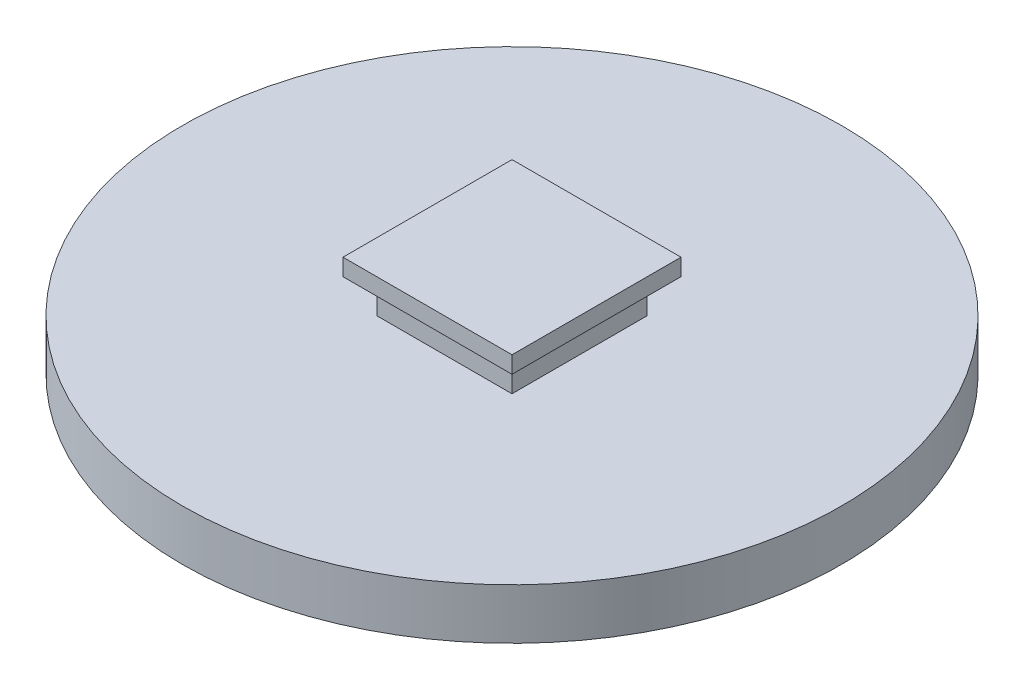
ISO-10303-21;
HEADER;
FILE_DESCRIPTION(('STEP AP214'),'2;1');
FILE_NAME('part.step','',(''),(''),'','','');
FILE_SCHEMA(('AUTOMOTIVE_DESIGN { 1 0 10303 214 1 1 1 1 }'));
ENDSEC;
DATA;
#1=APPLICATION_CONTEXT('core data for automotive mechanical design processes');
#2=APPLICATION_PROTOCOL_DEFINITION('international standard','automotive_design',2000,#1);
#3=PRODUCT_CONTEXT('',#1,'mechanical');
#4=PRODUCT('Part','Part','',(#3));
#5=PRODUCT_RELATED_PRODUCT_CATEGORY('part','',(#4));
#6=PRODUCT_DEFINITION_FORMATION('','',#4);
#7=PRODUCT_DEFINITION_CONTEXT('part definition',#1,'design');
#8=PRODUCT_DEFINITION('design','',#6,#7);
#9=PRODUCT_DEFINITION_SHAPE('','',#8);
#10=(LENGTH_UNIT() NAMED_UNIT(*) SI_UNIT(.MILLI.,.METRE.));
#11=(NAMED_UNIT(*) PLANE_ANGLE_UNIT() SI_UNIT($,.RADIAN.));
#12=(NAMED_UNIT(*) SI_UNIT($,.STERADIAN.) SOLID_ANGLE_UNIT());
#13=UNCERTAINTY_MEASURE_WITH_UNIT(LENGTH_MEASURE(1.E-05),#10,'distance_accuracy_value','');
#14=(GEOMETRIC_REPRESENTATION_CONTEXT(3) GLOBAL_UNCERTAINTY_ASSIGNED_CONTEXT((#13)) GLOBAL_UNIT_ASSIGNED_CONTEXT((#10,
#11,#12)) REPRESENTATION_CONTEXT('',''));
#15=CARTESIAN_POINT('',(0.,0.,0.));
#16=DIRECTION('',(0.,0.,1.));
#17=DIRECTION('',(1.,0.,0.));
#18=AXIS2_PLACEMENT_3D('',#15,#16,#17);
#19=CARTESIAN_POINT('',(0.,0.,0.));
#20=DIRECTION('',(0.,1.,0.));
#21=DIRECTION('',(0.,0.,1.));
#22=AXIS2_PLACEMENT_3D('',#19,#20,#21);
#23=PLANE('',#22);
#24=CARTESIAN_POINT('',(0.,0.,0.));
#25=DIRECTION('',(0.,1.,0.));
#26=DIRECTION('',(0.,0.,1.));
#27=AXIS2_PLACEMENT_3D('',#24,#25,#26);
#28=CIRCLE('',#27,49.53);
#29=CARTESIAN_POINT('',(0.,0.,-49.53));
#30=VERTEX_POINT('',#29);
#31=EDGE_CURVE('E40',#30,#30,#28,.T.);
#32=ORIENTED_EDGE('',*,*,#31,.F.);
#33=EDGE_LOOP('',(#32));
#34=FACE_BOUND('',#33,.T.);
#35=CARTESIAN_POINT('',(-48.26,0.,0.));
#36=DIRECTION('',(0.,-1.,0.));
#37=DIRECTION('',(0.,0.,-1.));
#38=AXIS2_PLACEMENT_3D('',#35,#36,#37);
#39=CIRCLE('',#38,0.889000000000003);
#40=CARTESIAN_POINT('',(-48.26,0.,-0.889000000000015));
#41=VERTEX_POINT('',#40);
#42=EDGE_CURVE('E257',#41,#41,#39,.T.);
#43=ORIENTED_EDGE('',*,*,#42,.F.);
#44=EDGE_LOOP('',(#43));
#45=FACE_BOUND('',#44,.T.);
#46=CARTESIAN_POINT('',(-34.1249732600627,0.,34.1249732600628));
#47=DIRECTION('',(0.,-1.,0.));
#48=DIRECTION('',(-0.707106781186549,0.,-0.707106781186546));
#49=AXIS2_PLACEMENT_3D('',#46,#47,#48);
#50=CIRCLE('',#49,0.889000000000003);
#51=CARTESIAN_POINT('',(-34.7535911885376,0.,33.496355331588));
#52=VERTEX_POINT('',#51);
#53=EDGE_CURVE('E233',#52,#52,#50,.T.);
#54=ORIENTED_EDGE('',*,*,#53,.F.);
#55=EDGE_LOOP('',(#54));
#56=FACE_BOUND('',#55,.T.);
#57=CARTESIAN_POINT('',(-34.1249732600632,0.,-34.1249732600624));
#58=DIRECTION('',(0.,-1.,0.));
#59=DIRECTION('',(0.707106781186539,0.,-0.707106781186556));
#60=AXIS2_PLACEMENT_3D('',#57,#58,#59);
#61=CIRCLE('',#60,0.889000000000003);
#62=CARTESIAN_POINT('',(-33.4963553315884,0.,-34.7535911885372));
#63=VERTEX_POINT('',#62);
#64=EDGE_CURVE('E217',#63,#63,#61,.T.);
#65=ORIENTED_EDGE('',*,*,#64,.F.);
#66=EDGE_LOOP('',(#65));
#67=FACE_BOUND('',#66,.T.);
#68=CARTESIAN_POINT('',(-4.93520847188847E-13,0.,-48.26));
#69=DIRECTION('',(0.,-1.,0.));
#70=DIRECTION('',(1.,0.,0.));
#71=AXIS2_PLACEMENT_3D('',#68,#69,#70);
#72=CIRCLE('',#71,0.889000000000003);
#73=CARTESIAN_POINT('',(0.88899999999951,0.,-48.26));
#74=VERTEX_POINT('',#73);
#75=EDGE_CURVE('E222',#74,#74,#72,.T.);
#76=ORIENTED_EDGE('',*,*,#75,.F.);
#77=EDGE_LOOP('',(#76));
#78=FACE_BOUND('',#77,.T.);
#79=CARTESIAN_POINT('',(34.1249732600625,0.,-34.1249732600631));
#80=DIRECTION('',(0.,-1.,0.));
#81=DIRECTION('',(0.707106781186554,0.,0.707106781186541));
#82=AXIS2_PLACEMENT_3D('',#79,#80,#81);
#83=CIRCLE('',#82,0.889000000000003);
#84=CARTESIAN_POINT('',(34.7535911885373,0.,-33.4963553315882));
#85=VERTEX_POINT('',#84);
#86=EDGE_CURVE('E221',#85,#85,#83,.T.);
#87=ORIENTED_EDGE('',*,*,#86,.F.);
#88=EDGE_LOOP('',(#87));
#89=FACE_BOUND('',#88,.T.);
#90=CARTESIAN_POINT('',(48.26,0.,0.));
#91=DIRECTION('',(0.,-1.,0.));
#92=DIRECTION('',(0.,0.,1.));
#93=AXIS2_PLACEMENT_3D('',#90,#91,#92);
#94=CIRCLE('',#93,0.889000000000003);
#95=CARTESIAN_POINT('',(48.26,0.,0.889000000000015));
#96=VERTEX_POINT('',#95);
#97=EDGE_CURVE('E246',#96,#96,#94,.T.);
#98=ORIENTED_EDGE('',*,*,#97,.F.);
#99=EDGE_LOOP('',(#98));
#100=FACE_BOUND('',#99,.T.);
#101=CARTESIAN_POINT('',(34.124973260063,0.,34.1249732600626));
#102=DIRECTION('',(0.,-1.,0.));
#103=DIRECTION('',(-0.707106781186544,0.,0.707106781186551));
#104=AXIS2_PLACEMENT_3D('',#101,#102,#103);
#105=CIRCLE('',#104,0.889000000000003);
#106=CARTESIAN_POINT('',(33.4963553315881,0.,34.7535911885374));
#107=VERTEX_POINT('',#106);
#108=EDGE_CURVE('E240',#107,#107,#105,.T.);
#109=ORIENTED_EDGE('',*,*,#108,.F.);
#110=EDGE_LOOP('',(#109));
#111=FACE_BOUND('',#110,.T.);
#112=CARTESIAN_POINT('',(1.56523068363708E-13,0.,48.26));
#113=DIRECTION('',(0.,-1.,0.));
#114=DIRECTION('',(-1.,0.,0.));
#115=AXIS2_PLACEMENT_3D('',#112,#113,#114);
#116=CIRCLE('',#115,0.889000000000003);
#117=CARTESIAN_POINT('',(-0.888999999999847,0.,48.26));
#118=VERTEX_POINT('',#117);
#119=EDGE_CURVE('E234',#118,#118,#116,.T.);
#120=ORIENTED_EDGE('',*,*,#119,.F.);
#121=EDGE_LOOP('',(#120));
#122=FACE_BOUND('',#121,.T.);
#123=DIRECTION('',(0.,0.,-1.));
#124=VECTOR('',#123,1.);
#125=CARTESIAN_POINT('',(-2.5273,0.,25.273));
#126=LINE('',#125,#124);
#127=CARTESIAN_POINT('',(-2.5273,0.,25.273));
#128=VERTEX_POINT('',#127);
#129=CARTESIAN_POINT('',(-2.52729999999999,0.,-25.273));
#130=VERTEX_POINT('',#129);
#131=EDGE_CURVE('E184',#128,#130,#126,.T.);
#132=ORIENTED_EDGE('',*,*,#131,.F.);
#133=DIRECTION('',(-1.,0.,0.));
#134=VECTOR('',#133,1.);
#135=CARTESIAN_POINT('',(2.52729999999999,0.,25.273));
#136=LINE('',#135,#134);
#137=CARTESIAN_POINT('',(2.52729999999999,0.,25.273));
#138=VERTEX_POINT('',#137);
#139=EDGE_CURVE('E189',#138,#128,#136,.T.);
#140=ORIENTED_EDGE('',*,*,#139,.F.);
#141=DIRECTION('',(0.,0.,1.));
#142=VECTOR('',#141,1.);
#143=CARTESIAN_POINT('',(2.52729999999999,0.,25.273));
#144=LINE('',#143,#142);
#145=CARTESIAN_POINT('',(2.52730000000001,0.,-25.273));
#146=VERTEX_POINT('',#145);
#147=EDGE_CURVE('E201',#146,#138,#144,.T.);
#148=ORIENTED_EDGE('',*,*,#147,.F.);
#149=DIRECTION('',(1.,0.,0.));
#150=VECTOR('',#149,1.);
#151=CARTESIAN_POINT('',(2.52730000000001,0.,-25.273));
#152=LINE('',#151,#150);
#153=EDGE_CURVE('E198',#130,#146,#152,.T.);
#154=ORIENTED_EDGE('',*,*,#153,.F.);
#155=EDGE_LOOP('',(#132,#140,#148,#154));
#156=FACE_BOUND('',#155,.T.);
#157=ADVANCED_FACE('F36',(#34,#45,#56,#67,#78,#89,#100,#111,#122,#156),#23,.F.);
#158=CARTESIAN_POINT('',(0.,7.62,0.));
#159=DIRECTION('',(0.,-1.,0.));
#160=DIRECTION('',(0.,0.,-1.));
#161=AXIS2_PLACEMENT_3D('',#158,#159,#160);
#162=CYLINDRICAL_SURFACE('',#161,49.53);
#163=CARTESIAN_POINT('',(0.,7.62,0.));
#164=DIRECTION('',(0.,1.,0.));
#165=DIRECTION('',(0.,0.,1.));
#166=AXIS2_PLACEMENT_3D('',#163,#164,#165);
#167=CIRCLE('',#166,49.53);
#168=CARTESIAN_POINT('',(0.,7.62,-49.53));
#169=VERTEX_POINT('',#168);
#170=EDGE_CURVE('E11',#169,#169,#167,.T.);
#171=CARTESIAN_POINT('',(0.,7.62,-49.53));
#172=CARTESIAN_POINT('',(0.,7.540625,-49.53));
#173=CARTESIAN_POINT('',(0.,7.46125,-49.53));
#174=CARTESIAN_POINT('',(0.,7.3025,-49.53));
#175=CARTESIAN_POINT('',(0.,7.223125,-49.53));
#176=CARTESIAN_POINT('',(0.,7.064375,-49.53));
#177=CARTESIAN_POINT('',(0.,6.985,-49.53));
#178=CARTESIAN_POINT('',(0.,6.82625,-49.53));
#179=CARTESIAN_POINT('',(0.,6.746875,-49.53));
#180=CARTESIAN_POINT('',(0.,6.588125,-49.53));
#181=CARTESIAN_POINT('',(0.,6.50875,-49.53));
#182=CARTESIAN_POINT('',(0.,6.35,-49.53));
#183=CARTESIAN_POINT('',(0.,6.270625,-49.53));
#184=CARTESIAN_POINT('',(0.,6.111875,-49.53));
#185=CARTESIAN_POINT('',(0.,6.0325,-49.53));
#186=CARTESIAN_POINT('',(0.,5.87375,-49.53));
#187=CARTESIAN_POINT('',(0.,5.794375,-49.53));
#188=CARTESIAN_POINT('',(0.,5.635625,-49.53));
#189=CARTESIAN_POINT('',(0.,5.55625,-49.53));
#190=CARTESIAN_POINT('',(0.,5.3975,-49.53));
#191=CARTESIAN_POINT('',(0.,5.318125,-49.53));
#192=CARTESIAN_POINT('',(0.,5.159375,-49.53));
#193=CARTESIAN_POINT('',(0.,5.08,-49.53));
#194=CARTESIAN_POINT('',(0.,4.92125,-49.53));
#195=CARTESIAN_POINT('',(0.,4.841875,-49.53));
#196=CARTESIAN_POINT('',(0.,4.683125,-49.53));
#197=CARTESIAN_POINT('',(0.,4.60375,-49.53));
#198=CARTESIAN_POINT('',(0.,4.445,-49.53));
#199=CARTESIAN_POINT('',(0.,4.365625,-49.53));
#200=CARTESIAN_POINT('',(0.,4.206875,-49.53));
#201=CARTESIAN_POINT('',(0.,4.1275,-49.53));
#202=CARTESIAN_POINT('',(0.,3.96875,-49.53));
#203=CARTESIAN_POINT('',(0.,3.889375,-49.53));
#204=CARTESIAN_POINT('',(0.,3.730625,-49.53));
#205=CARTESIAN_POINT('',(0.,3.65125,-49.53));
#206=CARTESIAN_POINT('',(0.,3.4925,-49.53));
#207=CARTESIAN_POINT('',(0.,3.413125,-49.53));
#208=CARTESIAN_POINT('',(0.,3.254375,-49.53));
#209=CARTESIAN_POINT('',(0.,3.175,-49.53));
#210=CARTESIAN_POINT('',(0.,3.01625,-49.53));
#211=CARTESIAN_POINT('',(0.,2.936875,-49.53));
#212=CARTESIAN_POINT('',(0.,2.778125,-49.53));
#213=CARTESIAN_POINT('',(0.,2.69875,-49.53));
#214=CARTESIAN_POINT('',(0.,2.54,-49.53));
#215=CARTESIAN_POINT('',(0.,2.460625,-49.53));
#216=CARTESIAN_POINT('',(0.,2.301875,-49.53));
#217=CARTESIAN_POINT('',(0.,2.2225,-49.53));
#218=CARTESIAN_POINT('',(0.,2.06375,-49.53));
#219=CARTESIAN_POINT('',(0.,1.984375,-49.53));
#220=CARTESIAN_POINT('',(0.,1.825625,-49.53));
#221=CARTESIAN_POINT('',(0.,1.74625,-49.53));
#222=CARTESIAN_POINT('',(0.,1.5875,-49.53));
#223=CARTESIAN_POINT('',(0.,1.508125,-49.53));
#224=CARTESIAN_POINT('',(0.,1.349375,-49.53));
#225=CARTESIAN_POINT('',(0.,1.27,-49.53));
#226=CARTESIAN_POINT('',(0.,1.11125,-49.53));
#227=CARTESIAN_POINT('',(0.,1.031875,-49.53));
#228=CARTESIAN_POINT('',(0.,0.873125,-49.53));
#229=CARTESIAN_POINT('',(0.,0.79375,-49.53));
#230=CARTESIAN_POINT('',(0.,0.635,-49.53));
#231=CARTESIAN_POINT('',(0.,0.555625,-49.53));
#232=CARTESIAN_POINT('',(0.,0.396875,-49.53));
#233=CARTESIAN_POINT('',(0.,0.3175,-49.53));
#234=CARTESIAN_POINT('',(0.,0.15875,-49.53));
#235=CARTESIAN_POINT('',(0.,0.0793749999999999,-49.53));
#236=CARTESIAN_POINT('',(0.,0.,-49.53));
#237=B_SPLINE_CURVE_WITH_KNOTS('',3,(#171,#172,#173,#174,#175,#176,#177,#178,#179,#180,#181,
#182,#183,#184,#185,#186,#187,#188,#189,#190,#191,#192,#193,#194,#195,#196,#197,#198,#199,#200,
#201,#202,#203,#204,#205,#206,#207,#208,#209,#210,#211,#212,#213,#214,#215,#216,#217,#218,#219,
#220,#221,#222,#223,#224,#225,#226,#227,#228,#229,#230,#231,#232,#233,#234,#235,#236),
.UNSPECIFIED.,.F.,.F.,(4,2,2,2,2,2,2,2,2,2,2,2,2,2,2,2,2,2,2,2,2,2,2,2,2,2,2,2,2,2,2,2,4),(0.,
0.238125,0.476249999999999,0.714375,0.952499999999999,1.190625,1.42875,1.666875,1.905,2.143125,
2.38125,2.619375,2.8575,3.095625,3.33375,3.571875,3.81,4.048125,4.28625,4.524375,4.7625,
5.000625,5.23875,5.476875,5.715,5.953125,6.19125,6.429375,6.6675,6.905625,7.14375,7.381875,
7.62),.UNSPECIFIED.);
#238=EDGE_CURVE('BSEAM38',#169,#30,#237,.T.);
#239=ORIENTED_EDGE('',*,*,#170,.F.);
#240=ORIENTED_EDGE('',*,*,#31,.T.);
#241=ORIENTED_EDGE('',*,*,#238,.T.);
#242=ORIENTED_EDGE('',*,*,#238,.F.);
#243=EDGE_LOOP('',(#239,#241,#240,#242));
#244=FACE_BOUND('',#243,.T.);
#245=ADVANCED_FACE('F38',(#244),#162,.T.);
#246=CARTESIAN_POINT('',(0.,7.62,0.));
#247=DIRECTION('',(0.,1.,0.));
#248=DIRECTION('',(0.,0.,1.));
#249=AXIS2_PLACEMENT_3D('',#246,#247,#248);
#250=PLANE('',#249);
#251=DIRECTION('',(0.,0.,1.));
#252=VECTOR('',#251,1.);
#253=CARTESIAN_POINT('',(-10.16,7.62,-10.16));
#254=LINE('',#253,#252);
#255=CARTESIAN_POINT('',(-10.16,7.62,-10.16));
#256=VERTEX_POINT('',#255);
#257=CARTESIAN_POINT('',(-10.16,7.62,10.16));
#258=VERTEX_POINT('',#257);
#259=EDGE_CURVE('E51',#256,#258,#254,.T.);
#260=ORIENTED_EDGE('',*,*,#259,.F.);
#261=DIRECTION('',(-1.,0.,0.));
#262=VECTOR('',#261,1.);
#263=CARTESIAN_POINT('',(10.16,7.62,-10.16));
#264=LINE('',#263,#262);
#265=CARTESIAN_POINT('',(10.16,7.62,-10.16));
#266=VERTEX_POINT('',#265);
#267=EDGE_CURVE('E55',#266,#256,#264,.T.);
#268=ORIENTED_EDGE('',*,*,#267,.F.);
#269=DIRECTION('',(0.,0.,-1.));
#270=VECTOR('',#269,1.);
#271=CARTESIAN_POINT('',(10.16,7.62,-10.16));
#272=LINE('',#271,#270);
#273=CARTESIAN_POINT('',(10.16,7.62,10.16));
#274=VERTEX_POINT('',#273);
#275=EDGE_CURVE('E170',#274,#266,#272,.T.);
#276=ORIENTED_EDGE('',*,*,#275,.F.);
#277=DIRECTION('',(1.,0.,0.));
#278=VECTOR('',#277,1.);
#279=CARTESIAN_POINT('',(10.16,7.62,10.16));
#280=LINE('',#279,#278);
#281=EDGE_CURVE('E149',#258,#274,#280,.T.);
#282=ORIENTED_EDGE('',*,*,#281,.F.);
#283=EDGE_LOOP('',(#260,#268,#276,#282));
#284=FACE_BOUND('',#283,.T.);
#285=ORIENTED_EDGE('',*,*,#170,.T.);
#286=EDGE_LOOP('',(#285));
#287=FACE_BOUND('',#286,.T.);
#288=ADVANCED_FACE('F374',(#284,#287),#250,.T.);
#289=CARTESIAN_POINT('',(-48.26,2.54,0.));
#290=DIRECTION('',(0.,-1.,0.));
#291=DIRECTION('',(0.,0.,-1.));
#292=AXIS2_PLACEMENT_3D('',#289,#290,#291);
#293=CYLINDRICAL_SURFACE('',#292,0.889000000000003);
#294=CARTESIAN_POINT('',(-48.26,2.54,0.));
#295=DIRECTION('',(0.,-1.,0.));
#296=DIRECTION('',(0.,0.,-1.));
#297=AXIS2_PLACEMENT_3D('',#294,#295,#296);
#298=CIRCLE('',#297,0.889000000000003);
#299=CARTESIAN_POINT('',(-48.26,2.54,-0.889000000000015));
#300=VERTEX_POINT('',#299);
#301=EDGE_CURVE('E260',#300,#300,#298,.T.);
#302=ORIENTED_EDGE('',*,*,#301,.F.);
#303=EDGE_LOOP('',(#302));
#304=FACE_BOUND('',#303,.T.);
#305=ORIENTED_EDGE('',*,*,#42,.T.);
#306=EDGE_LOOP('',(#305));
#307=FACE_BOUND('',#306,.T.);
#308=ADVANCED_FACE('F266',(#304,#307),#293,.F.);
#309=CARTESIAN_POINT('',(-48.26,2.54,0.));
#310=DIRECTION('',(0.,-1.,0.));
#311=DIRECTION('',(0.,0.,-1.));
#312=AXIS2_PLACEMENT_3D('',#309,#310,#311);
#313=PLANE('',#312);
#314=ORIENTED_EDGE('',*,*,#301,.T.);
#315=EDGE_LOOP('',(#314));
#316=FACE_BOUND('',#315,.T.);
#317=ADVANCED_FACE('F367',(#316),#313,.T.);
#318=CARTESIAN_POINT('',(-34.1249732600627,2.54,34.1249732600628));
#319=DIRECTION('',(0.,-1.,0.));
#320=DIRECTION('',(0.,0.,-1.));
#321=AXIS2_PLACEMENT_3D('',#318,#319,#320);
#322=CYLINDRICAL_SURFACE('',#321,0.889000000000003);
#323=CARTESIAN_POINT('',(-34.1249732600627,2.54,34.1249732600628));
#324=DIRECTION('',(0.,-1.,0.));
#325=DIRECTION('',(-0.707106781186549,0.,-0.707106781186546));
#326=AXIS2_PLACEMENT_3D('',#323,#324,#325);
#327=CIRCLE('',#326,0.889000000000003);
#328=CARTESIAN_POINT('',(-34.7535911885376,2.54,33.496355331588));
#329=VERTEX_POINT('',#328);
#330=EDGE_CURVE('E254',#329,#329,#327,.T.);
#331=ORIENTED_EDGE('',*,*,#330,.F.);
#332=EDGE_LOOP('',(#331));
#333=FACE_BOUND('',#332,.T.);
#334=ORIENTED_EDGE('',*,*,#53,.T.);
#335=EDGE_LOOP('',(#334));
#336=FACE_BOUND('',#335,.T.);
#337=ADVANCED_FACE('F363',(#333,#336),#322,.F.);
#338=CARTESIAN_POINT('',(-34.1249732600627,2.54,34.1249732600628));
#339=DIRECTION('',(0.,-1.,0.));
#340=DIRECTION('',(-0.707106781186549,0.,-0.707106781186546));
#341=AXIS2_PLACEMENT_3D('',#338,#339,#340);
#342=PLANE('',#341);
#343=ORIENTED_EDGE('',*,*,#330,.T.);
#344=EDGE_LOOP('',(#343));
#345=FACE_BOUND('',#344,.T.);
#346=ADVANCED_FACE('F329',(#345),#342,.T.);
#347=CARTESIAN_POINT('',(-34.1249732600632,2.54,-34.1249732600624));
#348=DIRECTION('',(0.,-1.,0.));
#349=DIRECTION('',(0.,0.,-1.));
#350=AXIS2_PLACEMENT_3D('',#347,#348,#349);
#351=CYLINDRICAL_SURFACE('',#350,0.889000000000003);
#352=CARTESIAN_POINT('',(-34.1249732600632,2.54,-34.1249732600624));
#353=DIRECTION('',(0.,-1.,0.));
#354=DIRECTION('',(0.707106781186539,0.,-0.707106781186556));
#355=AXIS2_PLACEMENT_3D('',#352,#353,#354);
#356=CIRCLE('',#355,0.889000000000003);
#357=CARTESIAN_POINT('',(-33.4963553315884,2.54,-34.7535911885372));
#358=VERTEX_POINT('',#357);
#359=EDGE_CURVE('E225',#358,#358,#356,.T.);
#360=ORIENTED_EDGE('',*,*,#359,.F.);
#361=EDGE_LOOP('',(#360));
#362=FACE_BOUND('',#361,.T.);
#363=ORIENTED_EDGE('',*,*,#64,.T.);
#364=EDGE_LOOP('',(#363));
#365=FACE_BOUND('',#364,.T.);
#366=ADVANCED_FACE('F325',(#362,#365),#351,.F.);
#367=CARTESIAN_POINT('',(-34.1249732600632,2.54,-34.1249732600624));
#368=DIRECTION('',(0.,-1.,0.));
#369=DIRECTION('',(0.707106781186539,0.,-0.707106781186556));
#370=AXIS2_PLACEMENT_3D('',#367,#368,#369);
#371=PLANE('',#370);
#372=ORIENTED_EDGE('',*,*,#359,.T.);
#373=EDGE_LOOP('',(#372));
#374=FACE_BOUND('',#373,.T.);
#375=ADVANCED_FACE('F321',(#374),#371,.T.);
#376=CARTESIAN_POINT('',(-4.93520847188847E-13,2.54,-48.26));
#377=DIRECTION('',(0.,-1.,0.));
#378=DIRECTION('',(0.,0.,-1.));
#379=AXIS2_PLACEMENT_3D('',#376,#377,#378);
#380=CYLINDRICAL_SURFACE('',#379,0.889000000000003);
#381=CARTESIAN_POINT('',(-4.93520847188847E-13,2.54,-48.26));
#382=DIRECTION('',(0.,-1.,0.));
#383=DIRECTION('',(1.,0.,0.));
#384=AXIS2_PLACEMENT_3D('',#381,#382,#383);
#385=CIRCLE('',#384,0.889000000000003);
#386=CARTESIAN_POINT('',(0.88899999999951,2.54,-48.26));
#387=VERTEX_POINT('',#386);
#388=EDGE_CURVE('E218',#387,#387,#385,.T.);
#389=ORIENTED_EDGE('',*,*,#388,.F.);
#390=EDGE_LOOP('',(#389));
#391=FACE_BOUND('',#390,.T.);
#392=ORIENTED_EDGE('',*,*,#75,.T.);
#393=EDGE_LOOP('',(#392));
#394=FACE_BOUND('',#393,.T.);
#395=ADVANCED_FACE('F317',(#391,#394),#380,.F.);
#396=CARTESIAN_POINT('',(-4.93520847188847E-13,2.54,-48.26));
#397=DIRECTION('',(0.,-1.,0.));
#398=DIRECTION('',(1.,0.,0.));
#399=AXIS2_PLACEMENT_3D('',#396,#397,#398);
#400=PLANE('',#399);
#401=ORIENTED_EDGE('',*,*,#388,.T.);
#402=EDGE_LOOP('',(#401));
#403=FACE_BOUND('',#402,.T.);
#404=ADVANCED_FACE('F313',(#403),#400,.T.);
#405=CARTESIAN_POINT('',(34.1249732600625,2.54,-34.1249732600631));
#406=DIRECTION('',(0.,-1.,0.));
#407=DIRECTION('',(0.,0.,-1.));
#408=AXIS2_PLACEMENT_3D('',#405,#406,#407);
#409=CYLINDRICAL_SURFACE('',#408,0.889000000000003);
#410=CARTESIAN_POINT('',(34.1249732600625,2.54,-34.1249732600631));
#411=DIRECTION('',(0.,-1.,0.));
#412=DIRECTION('',(0.707106781186554,0.,0.707106781186541));
#413=AXIS2_PLACEMENT_3D('',#410,#411,#412);
#414=CIRCLE('',#413,0.889000000000003);
#415=CARTESIAN_POINT('',(34.7535911885373,2.54,-33.4963553315882));
#416=VERTEX_POINT('',#415);
#417=EDGE_CURVE('E249',#416,#416,#414,.T.);
#418=ORIENTED_EDGE('',*,*,#417,.F.);
#419=EDGE_LOOP('',(#418));
#420=FACE_BOUND('',#419,.T.);
#421=ORIENTED_EDGE('',*,*,#86,.T.);
#422=EDGE_LOOP('',(#421));
#423=FACE_BOUND('',#422,.T.);
#424=ADVANCED_FACE('F316',(#420,#423),#409,.F.);
#425=CARTESIAN_POINT('',(34.1249732600625,2.54,-34.1249732600631));
#426=DIRECTION('',(0.,-1.,0.));
#427=DIRECTION('',(0.707106781186554,0.,0.707106781186541));
#428=AXIS2_PLACEMENT_3D('',#425,#426,#427);
#429=PLANE('',#428);
#430=ORIENTED_EDGE('',*,*,#417,.T.);
#431=EDGE_LOOP('',(#430));
#432=FACE_BOUND('',#431,.T.);
#433=ADVANCED_FACE('F353',(#432),#429,.T.);
#434=CARTESIAN_POINT('',(48.26,2.54,0.));
#435=DIRECTION('',(0.,-1.,0.));
#436=DIRECTION('',(0.,0.,-1.));
#437=AXIS2_PLACEMENT_3D('',#434,#435,#436);
#438=CYLINDRICAL_SURFACE('',#437,0.889000000000003);
#439=CARTESIAN_POINT('',(48.26,2.54,0.));
#440=DIRECTION('',(0.,-1.,0.));
#441=DIRECTION('',(0.,0.,1.));
#442=AXIS2_PLACEMENT_3D('',#439,#440,#441);
#443=CIRCLE('',#442,0.889000000000003);
#444=CARTESIAN_POINT('',(48.26,2.54,0.889000000000015));
#445=VERTEX_POINT('',#444);
#446=EDGE_CURVE('E243',#445,#445,#443,.T.);
#447=ORIENTED_EDGE('',*,*,#446,.F.);
#448=EDGE_LOOP('',(#447));
#449=FACE_BOUND('',#448,.T.);
#450=ORIENTED_EDGE('',*,*,#97,.T.);
#451=EDGE_LOOP('',(#450));
#452=FACE_BOUND('',#451,.T.);
#453=ADVANCED_FACE('F349',(#449,#452),#438,.F.);
#454=CARTESIAN_POINT('',(48.26,2.54,0.));
#455=DIRECTION('',(0.,-1.,0.));
#456=DIRECTION('',(0.,0.,1.));
#457=AXIS2_PLACEMENT_3D('',#454,#455,#456);
#458=PLANE('',#457);
#459=ORIENTED_EDGE('',*,*,#446,.T.);
#460=EDGE_LOOP('',(#459));
#461=FACE_BOUND('',#460,.T.);
#462=ADVANCED_FACE('F345',(#461),#458,.T.);
#463=CARTESIAN_POINT('',(34.124973260063,2.54,34.1249732600626));
#464=DIRECTION('',(0.,-1.,0.));
#465=DIRECTION('',(0.,0.,-1.));
#466=AXIS2_PLACEMENT_3D('',#463,#464,#465);
#467=CYLINDRICAL_SURFACE('',#466,0.889000000000003);
#468=CARTESIAN_POINT('',(34.124973260063,2.54,34.1249732600626));
#469=DIRECTION('',(0.,-1.,0.));
#470=DIRECTION('',(-0.707106781186544,0.,0.707106781186551));
#471=AXIS2_PLACEMENT_3D('',#468,#469,#470);
#472=CIRCLE('',#471,0.889000000000003);
#473=CARTESIAN_POINT('',(33.4963553315881,2.54,34.7535911885374));
#474=VERTEX_POINT('',#473);
#475=EDGE_CURVE('E237',#474,#474,#472,.T.);
#476=ORIENTED_EDGE('',*,*,#475,.F.);
#477=EDGE_LOOP('',(#476));
#478=FACE_BOUND('',#477,.T.);
#479=ORIENTED_EDGE('',*,*,#108,.T.);
#480=EDGE_LOOP('',(#479));
#481=FACE_BOUND('',#480,.T.);
#482=ADVANCED_FACE('F341',(#478,#481),#467,.F.);
#483=CARTESIAN_POINT('',(34.124973260063,2.54,34.1249732600626));
#484=DIRECTION('',(0.,-1.,0.));
#485=DIRECTION('',(-0.707106781186544,0.,0.707106781186551));
#486=AXIS2_PLACEMENT_3D('',#483,#484,#485);
#487=PLANE('',#486);
#488=ORIENTED_EDGE('',*,*,#475,.T.);
#489=EDGE_LOOP('',(#488));
#490=FACE_BOUND('',#489,.T.);
#491=ADVANCED_FACE('F337',(#490),#487,.T.);
#492=CARTESIAN_POINT('',(1.56523068363708E-13,2.54,48.26));
#493=DIRECTION('',(0.,-1.,0.));
#494=DIRECTION('',(0.,0.,-1.));
#495=AXIS2_PLACEMENT_3D('',#492,#493,#494);
#496=CYLINDRICAL_SURFACE('',#495,0.889000000000003);
#497=CARTESIAN_POINT('',(1.56523068363708E-13,2.54,48.26));
#498=DIRECTION('',(0.,-1.,0.));
#499=DIRECTION('',(-1.,0.,0.));
#500=AXIS2_PLACEMENT_3D('',#497,#498,#499);
#501=CIRCLE('',#500,0.889000000000003);
#502=CARTESIAN_POINT('',(-0.888999999999847,2.54,48.26));
#503=VERTEX_POINT('',#502);
#504=EDGE_CURVE('E230',#503,#503,#501,.T.);
#505=ORIENTED_EDGE('',*,*,#504,.F.);
#506=EDGE_LOOP('',(#505));
#507=FACE_BOUND('',#506,.T.);
#508=ORIENTED_EDGE('',*,*,#119,.T.);
#509=EDGE_LOOP('',(#508));
#510=FACE_BOUND('',#509,.T.);
#511=ADVANCED_FACE('F333',(#507,#510),#496,.F.);
#512=CARTESIAN_POINT('',(1.56523068363708E-13,2.54,48.26));
#513=DIRECTION('',(0.,-1.,0.));
#514=DIRECTION('',(-1.,0.,0.));
#515=AXIS2_PLACEMENT_3D('',#512,#513,#514);
#516=PLANE('',#515);
#517=ORIENTED_EDGE('',*,*,#504,.T.);
#518=EDGE_LOOP('',(#517));
#519=FACE_BOUND('',#518,.T.);
#520=ADVANCED_FACE('F309',(#519),#516,.T.);
#521=CARTESIAN_POINT('',(-2.5273,-2.54,25.273));
#522=DIRECTION('',(1.,0.,0.));
#523=DIRECTION('',(0.,0.,-1.));
#524=AXIS2_PLACEMENT_3D('',#521,#522,#523);
#525=PLANE('',#524);
#526=ORIENTED_EDGE('',*,*,#131,.T.);
#527=DIRECTION('',(0.,1.,0.));
#528=VECTOR('',#527,1.);
#529=CARTESIAN_POINT('',(-2.52729999999999,-2.54,-25.273));
#530=LINE('',#529,#528);
#531=CARTESIAN_POINT('',(-2.52729999999999,-2.54,-25.273));
#532=VERTEX_POINT('',#531);
#533=EDGE_CURVE('E214',#532,#130,#530,.T.);
#534=ORIENTED_EDGE('',*,*,#533,.F.);
#535=DIRECTION('',(0.,0.,-1.));
#536=VECTOR('',#535,1.);
#537=CARTESIAN_POINT('',(-2.5273,-2.54,25.273));
#538=LINE('',#537,#536);
#539=CARTESIAN_POINT('',(-2.5273,-2.54,25.273));
#540=VERTEX_POINT('',#539);
#541=EDGE_CURVE('E185',#540,#532,#538,.T.);
#542=ORIENTED_EDGE('',*,*,#541,.F.);
#543=DIRECTION('',(0.,1.,0.));
#544=VECTOR('',#543,1.);
#545=CARTESIAN_POINT('',(-2.5273,-2.54,25.273));
#546=LINE('',#545,#544);
#547=EDGE_CURVE('E195',#540,#128,#546,.T.);
#548=ORIENTED_EDGE('',*,*,#547,.T.);
#549=EDGE_LOOP('',(#526,#534,#542,#548));
#550=FACE_BOUND('',#549,.T.);
#551=ADVANCED_FACE('F293',(#550),#525,.F.);
#552=CARTESIAN_POINT('',(2.52730000000001,-2.54,-25.273));
#553=DIRECTION('',(0.,0.,1.));
#554=DIRECTION('',(1.,0.,0.));
#555=AXIS2_PLACEMENT_3D('',#552,#553,#554);
#556=PLANE('',#555);
#557=ORIENTED_EDGE('',*,*,#153,.T.);
#558=DIRECTION('',(0.,1.,0.));
#559=VECTOR('',#558,1.);
#560=CARTESIAN_POINT('',(2.52730000000001,-2.54,-25.273));
#561=LINE('',#560,#559);
#562=CARTESIAN_POINT('',(2.52730000000001,-2.54,-25.273));
#563=VERTEX_POINT('',#562);
#564=EDGE_CURVE('E211',#563,#146,#561,.T.);
#565=ORIENTED_EDGE('',*,*,#564,.F.);
#566=DIRECTION('',(1.,0.,0.));
#567=VECTOR('',#566,1.);
#568=CARTESIAN_POINT('',(2.52730000000001,-2.54,-25.273));
#569=LINE('',#568,#567);
#570=EDGE_CURVE('E188',#532,#563,#569,.T.);
#571=ORIENTED_EDGE('',*,*,#570,.F.);
#572=ORIENTED_EDGE('',*,*,#533,.T.);
#573=EDGE_LOOP('',(#557,#565,#571,#572));
#574=FACE_BOUND('',#573,.T.);
#575=ADVANCED_FACE('F301',(#574),#556,.F.);
#576=CARTESIAN_POINT('',(2.52729999999999,-2.54,25.273));
#577=DIRECTION('',(-1.,0.,0.));
#578=DIRECTION('',(0.,0.,1.));
#579=AXIS2_PLACEMENT_3D('',#576,#577,#578);
#580=PLANE('',#579);
#581=ORIENTED_EDGE('',*,*,#147,.T.);
#582=DIRECTION('',(0.,1.,0.));
#583=VECTOR('',#582,1.);
#584=CARTESIAN_POINT('',(2.52729999999999,-2.54,25.273));
#585=LINE('',#584,#583);
#586=CARTESIAN_POINT('',(2.52729999999999,-2.54,25.273));
#587=VERTEX_POINT('',#586);
#588=EDGE_CURVE('E208',#587,#138,#585,.T.);
#589=ORIENTED_EDGE('',*,*,#588,.F.);
#590=DIRECTION('',(0.,0.,1.));
#591=VECTOR('',#590,1.);
#592=CARTESIAN_POINT('',(2.52729999999999,-2.54,25.273));
#593=LINE('',#592,#591);
#594=EDGE_CURVE('E191',#563,#587,#593,.T.);
#595=ORIENTED_EDGE('',*,*,#594,.F.);
#596=ORIENTED_EDGE('',*,*,#564,.T.);
#597=EDGE_LOOP('',(#581,#589,#595,#596));
#598=FACE_BOUND('',#597,.T.);
#599=ADVANCED_FACE('F299',(#598),#580,.F.);
#600=CARTESIAN_POINT('',(2.52729999999999,-2.54,25.273));
#601=DIRECTION('',(0.,0.,-1.));
#602=DIRECTION('',(-1.,0.,0.));
#603=AXIS2_PLACEMENT_3D('',#600,#601,#602);
#604=PLANE('',#603);
#605=ORIENTED_EDGE('',*,*,#139,.T.);
#606=ORIENTED_EDGE('',*,*,#547,.F.);
#607=DIRECTION('',(-1.,0.,0.));
#608=VECTOR('',#607,1.);
#609=CARTESIAN_POINT('',(2.52729999999999,-2.54,25.273));
#610=LINE('',#609,#608);
#611=EDGE_CURVE('E193',#587,#540,#610,.T.);
#612=ORIENTED_EDGE('',*,*,#611,.F.);
#613=ORIENTED_EDGE('',*,*,#588,.T.);
#614=EDGE_LOOP('',(#605,#606,#612,#613));
#615=FACE_BOUND('',#614,.T.);
#616=ADVANCED_FACE('F289',(#615),#604,.F.);
#617=CARTESIAN_POINT('',(0.,-2.54,0.));
#618=DIRECTION('',(0.,1.,0.));
#619=DIRECTION('',(0.,0.,1.));
#620=AXIS2_PLACEMENT_3D('',#617,#618,#619);
#621=PLANE('',#620);
#622=ORIENTED_EDGE('',*,*,#541,.T.);
#623=ORIENTED_EDGE('',*,*,#570,.T.);
#624=ORIENTED_EDGE('',*,*,#594,.T.);
#625=ORIENTED_EDGE('',*,*,#611,.T.);
#626=EDGE_LOOP('',(#622,#623,#624,#625));
#627=FACE_BOUND('',#626,.T.);
#628=ADVANCED_FACE('F295',(#627),#621,.F.);
#629=CARTESIAN_POINT('',(-10.16,12.7,-10.16));
#630=DIRECTION('',(1.,0.,0.));
#631=DIRECTION('',(0.,0.,-1.));
#632=AXIS2_PLACEMENT_3D('',#629,#630,#631);
#633=PLANE('',#632);
#634=ORIENTED_EDGE('',*,*,#259,.T.);
#635=DIRECTION('',(0.,-1.,0.));
#636=VECTOR('',#635,1.);
#637=CARTESIAN_POINT('',(-10.16,12.7,10.16));
#638=LINE('',#637,#636);
#639=CARTESIAN_POINT('',(-10.16,12.7,10.16));
#640=VERTEX_POINT('',#639);
#641=EDGE_CURVE('E181',#640,#258,#638,.T.);
#642=ORIENTED_EDGE('',*,*,#641,.F.);
#643=DIRECTION('',(0.,0.,1.));
#644=VECTOR('',#643,1.);
#645=CARTESIAN_POINT('',(-10.16,12.7,-10.16));
#646=LINE('',#645,#644);
#647=CARTESIAN_POINT('',(-10.16,12.7,-10.16));
#648=VERTEX_POINT('',#647);
#649=EDGE_CURVE('E155',#648,#640,#646,.T.);
#650=ORIENTED_EDGE('',*,*,#649,.F.);
#651=DIRECTION('',(0.,-1.,0.));
#652=VECTOR('',#651,1.);
#653=CARTESIAN_POINT('',(-10.16,12.7,-10.16));
#654=LINE('',#653,#652);
#655=EDGE_CURVE('E166',#648,#256,#654,.T.);
#656=ORIENTED_EDGE('',*,*,#655,.T.);
#657=EDGE_LOOP('',(#634,#642,#650,#656));
#658=FACE_BOUND('',#657,.T.);
#659=ADVANCED_FACE('F428',(#658),#633,.F.);
#660=CARTESIAN_POINT('',(10.16,12.7,10.16));
#661=DIRECTION('',(0.,0.,-1.));
#662=DIRECTION('',(-1.,0.,0.));
#663=AXIS2_PLACEMENT_3D('',#660,#661,#662);
#664=PLANE('',#663);
#665=ORIENTED_EDGE('',*,*,#281,.T.);
#666=DIRECTION('',(0.,-1.,0.));
#667=VECTOR('',#666,1.);
#668=CARTESIAN_POINT('',(10.16,12.7,10.16));
#669=LINE('',#668,#667);
#670=CARTESIAN_POINT('',(10.16,12.7,10.16));
#671=VERTEX_POINT('',#670);
#672=EDGE_CURVE('E178',#671,#274,#669,.T.);
#673=ORIENTED_EDGE('',*,*,#672,.F.);
#674=DIRECTION('',(1.,0.,0.));
#675=VECTOR('',#674,1.);
#676=CARTESIAN_POINT('',(10.16,12.7,10.16));
#677=LINE('',#676,#675);
#678=EDGE_CURVE('E158',#640,#671,#677,.T.);
#679=ORIENTED_EDGE('',*,*,#678,.F.);
#680=ORIENTED_EDGE('',*,*,#641,.T.);
#681=EDGE_LOOP('',(#665,#673,#679,#680));
#682=FACE_BOUND('',#681,.T.);
#683=ADVANCED_FACE('F443',(#682),#664,.F.);
#684=CARTESIAN_POINT('',(10.16,12.7,-10.16));
#685=DIRECTION('',(-1.,0.,0.));
#686=DIRECTION('',(0.,0.,1.));
#687=AXIS2_PLACEMENT_3D('',#684,#685,#686);
#688=PLANE('',#687);
#689=ORIENTED_EDGE('',*,*,#275,.T.);
#690=DIRECTION('',(0.,-1.,0.));
#691=VECTOR('',#690,1.);
#692=CARTESIAN_POINT('',(10.16,12.7,-10.16));
#693=LINE('',#692,#691);
#694=CARTESIAN_POINT('',(10.16,12.7,-10.16));
#695=VERTEX_POINT('',#694);
#696=EDGE_CURVE('E175',#695,#266,#693,.T.);
#697=ORIENTED_EDGE('',*,*,#696,.F.);
#698=DIRECTION('',(0.,0.,-1.));
#699=VECTOR('',#698,1.);
#700=CARTESIAN_POINT('',(10.16,12.7,-10.16));
#701=LINE('',#700,#699);
#702=EDGE_CURVE('E161',#671,#695,#701,.T.);
#703=ORIENTED_EDGE('',*,*,#702,.F.);
#704=ORIENTED_EDGE('',*,*,#672,.T.);
#705=EDGE_LOOP('',(#689,#697,#703,#704));
#706=FACE_BOUND('',#705,.T.);
#707=ADVANCED_FACE('F453',(#706),#688,.F.);
#708=CARTESIAN_POINT('',(10.16,12.7,-10.16));
#709=DIRECTION('',(0.,0.,1.));
#710=DIRECTION('',(1.,0.,0.));
#711=AXIS2_PLACEMENT_3D('',#708,#709,#710);
#712=PLANE('',#711);
#713=ORIENTED_EDGE('',*,*,#267,.T.);
#714=ORIENTED_EDGE('',*,*,#655,.F.);
#715=DIRECTION('',(-1.,0.,0.));
#716=VECTOR('',#715,1.);
#717=CARTESIAN_POINT('',(10.16,12.7,-10.16));
#718=LINE('',#717,#716);
#719=EDGE_CURVE('E164',#695,#648,#718,.T.);
#720=ORIENTED_EDGE('',*,*,#719,.F.);
#721=ORIENTED_EDGE('',*,*,#696,.T.);
#722=EDGE_LOOP('',(#713,#714,#720,#721));
#723=FACE_BOUND('',#722,.T.);
#724=ADVANCED_FACE('F463',(#723),#712,.F.);
#725=CARTESIAN_POINT('',(-12.7,15.24,-12.7));
#726=DIRECTION('',(1.,0.,0.));
#727=DIRECTION('',(0.,0.,-1.));
#728=AXIS2_PLACEMENT_3D('',#725,#726,#727);
#729=PLANE('',#728);
#730=DIRECTION('',(0.,0.,1.));
#731=VECTOR('',#730,1.);
#732=CARTESIAN_POINT('',(-12.7,12.7,-12.7));
#733=LINE('',#732,#731);
#734=CARTESIAN_POINT('',(-12.7,12.7,-12.7));
#735=VERTEX_POINT('',#734);
#736=CARTESIAN_POINT('',(-12.7,12.7,12.7));
#737=VERTEX_POINT('',#736);
#738=EDGE_CURVE('E147',#735,#737,#733,.T.);
#739=ORIENTED_EDGE('',*,*,#738,.T.);
#740=DIRECTION('',(0.,-1.,0.));
#741=VECTOR('',#740,1.);
#742=CARTESIAN_POINT('',(-12.7,15.24,12.7));
#743=LINE('',#742,#741);
#744=CARTESIAN_POINT('',(-12.7,15.24,12.7));
#745=VERTEX_POINT('',#744);
#746=EDGE_CURVE('E127',#745,#737,#743,.T.);
#747=ORIENTED_EDGE('',*,*,#746,.F.);
#748=DIRECTION('',(0.,0.,1.));
#749=VECTOR('',#748,1.);
#750=CARTESIAN_POINT('',(-12.7,15.24,-12.7));
#751=LINE('',#750,#749);
#752=CARTESIAN_POINT('',(-12.7,15.24,-12.7));
#753=VERTEX_POINT('',#752);
#754=EDGE_CURVE('E134',#753,#745,#751,.T.);
#755=ORIENTED_EDGE('',*,*,#754,.F.);
#756=DIRECTION('',(0.,-1.,0.));
#757=VECTOR('',#756,1.);
#758=CARTESIAN_POINT('',(-12.7,15.24,-12.7));
#759=LINE('',#758,#757);
#760=EDGE_CURVE('E544',#753,#735,#759,.T.);
#761=ORIENTED_EDGE('',*,*,#760,.T.);
#762=EDGE_LOOP('',(#739,#747,#755,#761));
#763=FACE_BOUND('',#762,.T.);
#764=ADVANCED_FACE('F145',(#763),#729,.F.);
#765=CARTESIAN_POINT('',(12.7,15.24,12.7));
#766=DIRECTION('',(0.,0.,-1.));
#767=DIRECTION('',(-1.,0.,0.));
#768=AXIS2_PLACEMENT_3D('',#765,#766,#767);
#769=PLANE('',#768);
#770=DIRECTION('',(1.,0.,0.));
#771=VECTOR('',#770,1.);
#772=CARTESIAN_POINT('',(12.7,12.7,12.7));
#773=LINE('',#772,#771);
#774=CARTESIAN_POINT('',(12.7,12.7,12.7));
#775=VERTEX_POINT('',#774);
#776=EDGE_CURVE('E535',#737,#775,#773,.T.);
#777=ORIENTED_EDGE('',*,*,#776,.T.);
#778=DIRECTION('',(0.,-1.,0.));
#779=VECTOR('',#778,1.);
#780=CARTESIAN_POINT('',(12.7,15.24,12.7));
#781=LINE('',#780,#779);
#782=CARTESIAN_POINT('',(12.7,15.24,12.7));
#783=VERTEX_POINT('',#782);
#784=EDGE_CURVE('E130',#783,#775,#781,.T.);
#785=ORIENTED_EDGE('',*,*,#784,.F.);
#786=DIRECTION('',(1.,0.,0.));
#787=VECTOR('',#786,1.);
#788=CARTESIAN_POINT('',(12.7,15.24,12.7));
#789=LINE('',#788,#787);
#790=EDGE_CURVE('E123',#745,#783,#789,.T.);
#791=ORIENTED_EDGE('',*,*,#790,.F.);
#792=ORIENTED_EDGE('',*,*,#746,.T.);
#793=EDGE_LOOP('',(#777,#785,#791,#792));
#794=FACE_BOUND('',#793,.T.);
#795=ADVANCED_FACE('F125',(#794),#769,.F.);
#796=CARTESIAN_POINT('',(12.7,15.24,-12.7));
#797=DIRECTION('',(-1.,0.,0.));
#798=DIRECTION('',(0.,0.,1.));
#799=AXIS2_PLACEMENT_3D('',#796,#797,#798);
#800=PLANE('',#799);
#801=DIRECTION('',(0.,0.,-1.));
#802=VECTOR('',#801,1.);
#803=CARTESIAN_POINT('',(12.7,12.7,-12.7));
#804=LINE('',#803,#802);
#805=CARTESIAN_POINT('',(12.7,12.7,-12.7));
#806=VERTEX_POINT('',#805);
#807=EDGE_CURVE('E537',#775,#806,#804,.T.);
#808=ORIENTED_EDGE('',*,*,#807,.T.);
#809=DIRECTION('',(0.,-1.,0.));
#810=VECTOR('',#809,1.);
#811=CARTESIAN_POINT('',(12.7,15.24,-12.7));
#812=LINE('',#811,#810);
#813=CARTESIAN_POINT('',(12.7,15.24,-12.7));
#814=VERTEX_POINT('',#813);
#815=EDGE_CURVE('E151',#814,#806,#812,.T.);
#816=ORIENTED_EDGE('',*,*,#815,.F.);
#817=DIRECTION('',(0.,0.,-1.));
#818=VECTOR('',#817,1.);
#819=CARTESIAN_POINT('',(12.7,15.24,-12.7));
#820=LINE('',#819,#818);
#821=EDGE_CURVE('E133',#783,#814,#820,.T.);
#822=ORIENTED_EDGE('',*,*,#821,.F.);
#823=ORIENTED_EDGE('',*,*,#784,.T.);
#824=EDGE_LOOP('',(#808,#816,#822,#823));
#825=FACE_BOUND('',#824,.T.);
#826=ADVANCED_FACE('F490',(#825),#800,.F.);
#827=CARTESIAN_POINT('',(12.7,15.24,-12.7));
#828=DIRECTION('',(0.,0.,1.));
#829=DIRECTION('',(1.,0.,0.));
#830=AXIS2_PLACEMENT_3D('',#827,#828,#829);
#831=PLANE('',#830);
#832=DIRECTION('',(-1.,0.,0.));
#833=VECTOR('',#832,1.);
#834=CARTESIAN_POINT('',(12.7,12.7,-12.7));
#835=LINE('',#834,#833);
#836=EDGE_CURVE('E143',#806,#735,#835,.T.);
#837=ORIENTED_EDGE('',*,*,#836,.T.);
#838=ORIENTED_EDGE('',*,*,#760,.F.);
#839=DIRECTION('',(-1.,0.,0.));
#840=VECTOR('',#839,1.);
#841=CARTESIAN_POINT('',(12.7,15.24,-12.7));
#842=LINE('',#841,#840);
#843=EDGE_CURVE('E139',#814,#753,#842,.T.);
#844=ORIENTED_EDGE('',*,*,#843,.F.);
#845=ORIENTED_EDGE('',*,*,#815,.T.);
#846=EDGE_LOOP('',(#837,#838,#844,#845));
#847=FACE_BOUND('',#846,.T.);
#848=ADVANCED_FACE('F499',(#847),#831,.F.);
#849=CARTESIAN_POINT('',(0.,15.24,0.));
#850=DIRECTION('',(0.,-1.,0.));
#851=DIRECTION('',(0.,0.,-1.));
#852=AXIS2_PLACEMENT_3D('',#849,#850,#851);
#853=PLANE('',#852);
#854=ORIENTED_EDGE('',*,*,#754,.T.);
#855=ORIENTED_EDGE('',*,*,#790,.T.);
#856=ORIENTED_EDGE('',*,*,#821,.T.);
#857=ORIENTED_EDGE('',*,*,#843,.T.);
#858=EDGE_LOOP('',(#854,#855,#856,#857));
#859=FACE_BOUND('',#858,.T.);
#860=ADVANCED_FACE('F137',(#859),#853,.F.);
#861=CARTESIAN_POINT('',(0.,12.7,0.));
#862=DIRECTION('',(0.,-1.,0.));
#863=DIRECTION('',(0.,0.,-1.));
#864=AXIS2_PLACEMENT_3D('',#861,#862,#863);
#865=PLANE('',#864);
#866=ORIENTED_EDGE('',*,*,#719,.T.);
#867=ORIENTED_EDGE('',*,*,#649,.T.);
#868=ORIENTED_EDGE('',*,*,#678,.T.);
#869=ORIENTED_EDGE('',*,*,#702,.T.);
#870=EDGE_LOOP('',(#866,#867,#868,#869));
#871=FACE_BOUND('',#870,.T.);
#872=ORIENTED_EDGE('',*,*,#738,.F.);
#873=ORIENTED_EDGE('',*,*,#836,.F.);
#874=ORIENTED_EDGE('',*,*,#807,.F.);
#875=ORIENTED_EDGE('',*,*,#776,.F.);
#876=EDGE_LOOP('',(#872,#873,#874,#875));
#877=FACE_BOUND('',#876,.T.);
#878=ADVANCED_FACE('F518',(#871,#877),#865,.T.);
#879=CLOSED_SHELL('',(#157,#245,#288,#308,#317,#337,#346,#366,#375,#395,#404,#424,#433,#453,
#462,#482,#491,#511,#520,#551,#575,#599,#616,#628,#659,#683,#707,#724,#764,#795,#826,#848,#860,#878));
#880=MANIFOLD_SOLID_BREP('B2',#879);
#881=ADVANCED_BREP_SHAPE_REPRESENTATION('',(#18,#880),#14);
#882=SHAPE_DEFINITION_REPRESENTATION(#9,#881);
ENDSEC;
END-ISO-10303-21;
